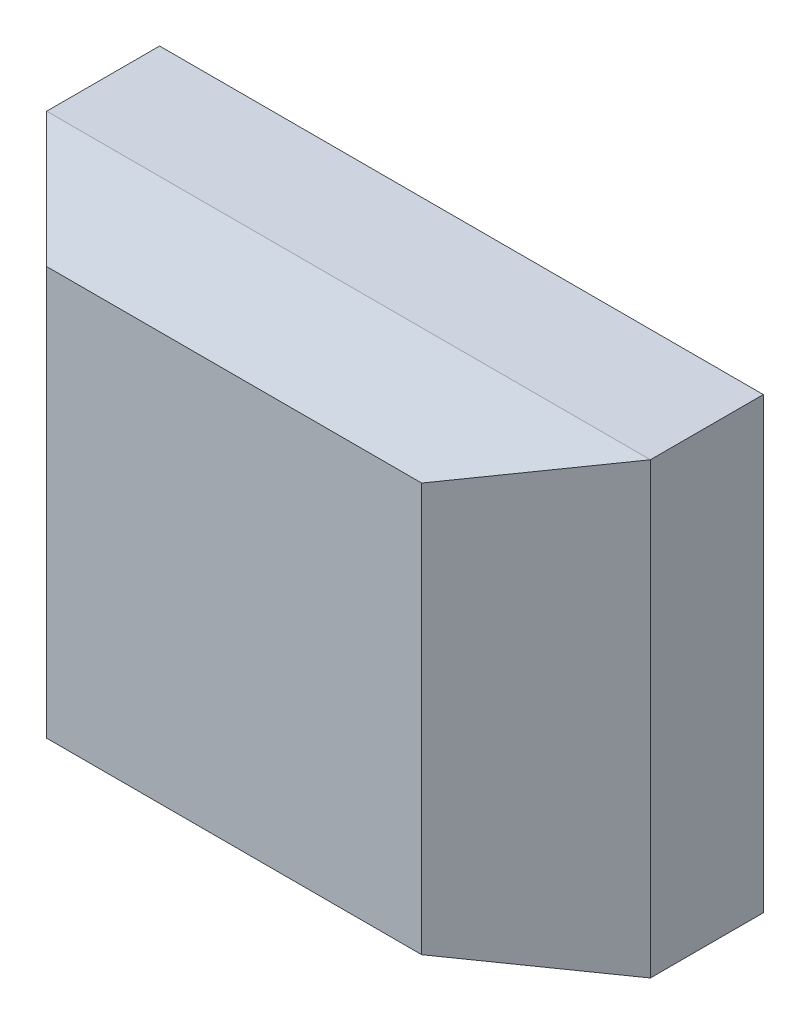
ISO-10303-21;
HEADER;
FILE_DESCRIPTION(('STEP AP214'),'2;1');
FILE_NAME('part.step','',(''),(''),'','','');
FILE_SCHEMA(('AUTOMOTIVE_DESIGN { 1 0 10303 214 1 1 1 1 }'));
ENDSEC;
DATA;
#1=APPLICATION_CONTEXT('core data for automotive mechanical design processes');
#2=APPLICATION_PROTOCOL_DEFINITION('international standard','automotive_design',2000,#1);
#3=PRODUCT_CONTEXT('',#1,'mechanical');
#4=PRODUCT('Part','Part','',(#3));
#5=PRODUCT_RELATED_PRODUCT_CATEGORY('part','',(#4));
#6=PRODUCT_DEFINITION_FORMATION('','',#4);
#7=PRODUCT_DEFINITION_CONTEXT('part definition',#1,'design');
#8=PRODUCT_DEFINITION('design','',#6,#7);
#9=PRODUCT_DEFINITION_SHAPE('','',#8);
#10=(LENGTH_UNIT() NAMED_UNIT(*) SI_UNIT(.MILLI.,.METRE.));
#11=(NAMED_UNIT(*) PLANE_ANGLE_UNIT() SI_UNIT($,.RADIAN.));
#12=(NAMED_UNIT(*) SI_UNIT($,.STERADIAN.) SOLID_ANGLE_UNIT());
#13=UNCERTAINTY_MEASURE_WITH_UNIT(LENGTH_MEASURE(1.E-05),#10,'distance_accuracy_value','');
#14=(GEOMETRIC_REPRESENTATION_CONTEXT(3) GLOBAL_UNCERTAINTY_ASSIGNED_CONTEXT((#13)) GLOBAL_UNIT_ASSIGNED_CONTEXT((#10,
#11,#12)) REPRESENTATION_CONTEXT('',''));
#15=CARTESIAN_POINT('',(0.,0.,0.));
#16=DIRECTION('',(0.,0.,1.));
#17=DIRECTION('',(1.,0.,0.));
#18=AXIS2_PLACEMENT_3D('',#15,#16,#17);
#19=CARTESIAN_POINT('',(2.085,-3.1,0.));
#20=DIRECTION('',(1.,0.,0.));
#21=DIRECTION('',(0.,0.,-1.));
#22=AXIS2_PLACEMENT_3D('',#19,#20,#21);
#23=PLANE('',#22);
#24=DIRECTION('',(0.,0.,-1.));
#25=VECTOR('',#24,1.);
#26=CARTESIAN_POINT('',(2.085,0.,0.));
#27=LINE('',#26,#25);
#28=CARTESIAN_POINT('',(2.085,0.,0.779999999999999));
#29=VERTEX_POINT('',#28);
#30=CARTESIAN_POINT('',(2.085,0.,0.));
#31=VERTEX_POINT('',#30);
#32=EDGE_CURVE('E141',#29,#31,#27,.T.);
#33=ORIENTED_EDGE('',*,*,#32,.F.);
#34=DIRECTION('',(0.,1.,0.));
#35=VECTOR('',#34,1.);
#36=CARTESIAN_POINT('',(2.085,-3.1,0.779999999999999));
#37=LINE('',#36,#35);
#38=CARTESIAN_POINT('',(2.085,-3.1,0.779999999999999));
#39=VERTEX_POINT('',#38);
#40=EDGE_CURVE('E11',#39,#29,#37,.T.);
#41=ORIENTED_EDGE('',*,*,#40,.F.);
#42=DIRECTION('',(0.,0.,-1.));
#43=VECTOR('',#42,1.);
#44=CARTESIAN_POINT('',(2.085,-3.1,0.));
#45=LINE('',#44,#43);
#46=CARTESIAN_POINT('',(2.085,-3.1,0.));
#47=VERTEX_POINT('',#46);
#48=EDGE_CURVE('E134',#39,#47,#45,.T.);
#49=ORIENTED_EDGE('',*,*,#48,.T.);
#50=DIRECTION('',(0.,1.,0.));
#51=VECTOR('',#50,1.);
#52=CARTESIAN_POINT('',(2.085,-3.1,0.));
#53=LINE('',#52,#51);
#54=EDGE_CURVE('E45',#47,#31,#53,.T.);
#55=ORIENTED_EDGE('',*,*,#54,.T.);
#56=EDGE_LOOP('',(#33,#41,#49,#55));
#57=FACE_BOUND('',#56,.T.);
#58=ADVANCED_FACE('F42',(#57),#23,.T.);
#59=CARTESIAN_POINT('',(2.085,-3.1,0.779999999999999));
#60=DIRECTION('',(0.707106781186546,0.,0.707106781186549));
#61=DIRECTION('',(0.707106781186549,0.,-0.707106781186546));
#62=AXIS2_PLACEMENT_3D('',#59,#60,#61);
#63=PLANE('',#62);
#64=DIRECTION('',(0.701673843159865,0.123724030206479,-0.701673843159863));
#65=VECTOR('',#64,1.);
#66=CARTESIAN_POINT('',(1.81587686112476,-0.0474536705166546,1.04912313887524));
#67=LINE('',#66,#65);
#68=CARTESIAN_POINT('',(1.295,-0.139298314759682,1.57));
#69=VERTEX_POINT('',#68);
#70=EDGE_CURVE('E83',#69,#29,#67,.T.);
#71=ORIENTED_EDGE('',*,*,#70,.F.);
#72=DIRECTION('',(0.,1.,0.));
#73=VECTOR('',#72,1.);
#74=CARTESIAN_POINT('',(1.295,-3.1,1.57));
#75=LINE('',#74,#73);
#76=CARTESIAN_POINT('',(1.295,-2.96070168524032,1.57));
#77=VERTEX_POINT('',#76);
#78=EDGE_CURVE('E52',#77,#69,#75,.T.);
#79=ORIENTED_EDGE('',*,*,#78,.F.);
#80=DIRECTION('',(-0.701673843159865,0.123724030206479,0.701673843159863));
#81=VECTOR('',#80,1.);
#82=CARTESIAN_POINT('',(2.085,-3.1,0.779999999999999));
#83=LINE('',#82,#81);
#84=EDGE_CURVE('E158',#39,#77,#83,.T.);
#85=ORIENTED_EDGE('',*,*,#84,.F.);
#86=ORIENTED_EDGE('',*,*,#40,.T.);
#87=EDGE_LOOP('',(#71,#79,#85,#86));
#88=FACE_BOUND('',#87,.T.);
#89=ADVANCED_FACE('F180',(#88),#63,.T.);
#90=CARTESIAN_POINT('',(1.295,-3.1,1.57));
#91=DIRECTION('',(0.,0.,1.));
#92=DIRECTION('',(1.,0.,0.));
#93=AXIS2_PLACEMENT_3D('',#90,#91,#92);
#94=PLANE('',#93);
#95=DIRECTION('',(1.,0.,0.));
#96=VECTOR('',#95,1.);
#97=CARTESIAN_POINT('',(1.295,-0.139298314759682,1.57));
#98=LINE('',#97,#96);
#99=CARTESIAN_POINT('',(-1.295,-0.139298314759682,1.57));
#100=VERTEX_POINT('',#99);
#101=EDGE_CURVE('E121',#100,#69,#98,.T.);
#102=ORIENTED_EDGE('',*,*,#101,.F.);
#103=DIRECTION('',(0.,1.,0.));
#104=VECTOR('',#103,1.);
#105=CARTESIAN_POINT('',(-1.295,-3.1,1.57));
#106=LINE('',#105,#104);
#107=CARTESIAN_POINT('',(-1.295,-2.96070168524032,1.57));
#108=VERTEX_POINT('',#107);
#109=EDGE_CURVE('E119',#108,#100,#106,.T.);
#110=ORIENTED_EDGE('',*,*,#109,.F.);
#111=DIRECTION('',(-1.,0.,0.));
#112=VECTOR('',#111,1.);
#113=CARTESIAN_POINT('',(1.295,-2.96070168524032,1.57));
#114=LINE('',#113,#112);
#115=EDGE_CURVE('E160',#77,#108,#114,.T.);
#116=ORIENTED_EDGE('',*,*,#115,.F.);
#117=ORIENTED_EDGE('',*,*,#78,.T.);
#118=EDGE_LOOP('',(#102,#110,#116,#117));
#119=FACE_BOUND('',#118,.T.);
#120=ADVANCED_FACE('F194',(#119),#94,.T.);
#121=CARTESIAN_POINT('',(-2.085,-3.1,0.779999999999999));
#122=DIRECTION('',(-0.707106781186546,0.,0.707106781186549));
#123=DIRECTION('',(0.707106781186549,0.,0.707106781186546));
#124=AXIS2_PLACEMENT_3D('',#121,#122,#123);
#125=PLANE('',#124);
#126=DIRECTION('',(0.701673843159865,-0.123724030206479,0.701673843159863));
#127=VECTOR('',#126,1.);
#128=CARTESIAN_POINT('',(-1.81587686112476,-0.0474536705166546,1.04912313887524));
#129=LINE('',#128,#127);
#130=CARTESIAN_POINT('',(-2.085,0.,0.779999999999999));
#131=VERTEX_POINT('',#130);
#132=EDGE_CURVE('E103',#131,#100,#129,.T.);
#133=ORIENTED_EDGE('',*,*,#132,.F.);
#134=DIRECTION('',(0.,1.,0.));
#135=VECTOR('',#134,1.);
#136=CARTESIAN_POINT('',(-2.085,-3.1,0.779999999999999));
#137=LINE('',#136,#135);
#138=CARTESIAN_POINT('',(-2.085,-3.1,0.779999999999999));
#139=VERTEX_POINT('',#138);
#140=EDGE_CURVE('E116',#139,#131,#137,.T.);
#141=ORIENTED_EDGE('',*,*,#140,.F.);
#142=DIRECTION('',(-0.701673843159865,-0.123724030206479,-0.701673843159863));
#143=VECTOR('',#142,1.);
#144=CARTESIAN_POINT('',(-2.085,-3.1,0.779999999999999));
#145=LINE('',#144,#143);
#146=EDGE_CURVE('E61',#108,#139,#145,.T.);
#147=ORIENTED_EDGE('',*,*,#146,.F.);
#148=ORIENTED_EDGE('',*,*,#109,.T.);
#149=EDGE_LOOP('',(#133,#141,#147,#148));
#150=FACE_BOUND('',#149,.T.);
#151=ADVANCED_FACE('F115',(#150),#125,.T.);
#152=CARTESIAN_POINT('',(-2.085,-3.1,0.));
#153=DIRECTION('',(-1.,0.,0.));
#154=DIRECTION('',(0.,0.,1.));
#155=AXIS2_PLACEMENT_3D('',#152,#153,#154);
#156=PLANE('',#155);
#157=DIRECTION('',(0.,0.,1.));
#158=VECTOR('',#157,1.);
#159=CARTESIAN_POINT('',(-2.085,0.,0.));
#160=LINE('',#159,#158);
#161=CARTESIAN_POINT('',(-2.085,0.,0.));
#162=VERTEX_POINT('',#161);
#163=EDGE_CURVE('E125',#162,#131,#160,.T.);
#164=ORIENTED_EDGE('',*,*,#163,.F.);
#165=DIRECTION('',(0.,1.,0.));
#166=VECTOR('',#165,1.);
#167=CARTESIAN_POINT('',(-2.085,-3.1,0.));
#168=LINE('',#167,#166);
#169=CARTESIAN_POINT('',(-2.085,-3.1,0.));
#170=VERTEX_POINT('',#169);
#171=EDGE_CURVE('E76',#170,#162,#168,.T.);
#172=ORIENTED_EDGE('',*,*,#171,.F.);
#173=DIRECTION('',(0.,0.,1.));
#174=VECTOR('',#173,1.);
#175=CARTESIAN_POINT('',(-2.085,-3.1,0.));
#176=LINE('',#175,#174);
#177=EDGE_CURVE('E128',#170,#139,#176,.T.);
#178=ORIENTED_EDGE('',*,*,#177,.T.);
#179=ORIENTED_EDGE('',*,*,#140,.T.);
#180=EDGE_LOOP('',(#164,#172,#178,#179));
#181=FACE_BOUND('',#180,.T.);
#182=ADVANCED_FACE('F124',(#181),#156,.T.);
#183=CARTESIAN_POINT('',(-2.085,-3.1,0.));
#184=DIRECTION('',(0.,0.,-1.));
#185=DIRECTION('',(-1.,0.,0.));
#186=AXIS2_PLACEMENT_3D('',#183,#184,#185);
#187=PLANE('',#186);
#188=DIRECTION('',(-1.,0.,0.));
#189=VECTOR('',#188,1.);
#190=CARTESIAN_POINT('',(-2.085,0.,0.));
#191=LINE('',#190,#189);
#192=EDGE_CURVE('E132',#31,#162,#191,.T.);
#193=ORIENTED_EDGE('',*,*,#192,.F.);
#194=ORIENTED_EDGE('',*,*,#54,.F.);
#195=DIRECTION('',(-1.,0.,0.));
#196=VECTOR('',#195,1.);
#197=CARTESIAN_POINT('',(-2.085,-3.1,0.));
#198=LINE('',#197,#196);
#199=EDGE_CURVE('E139',#47,#170,#198,.T.);
#200=ORIENTED_EDGE('',*,*,#199,.T.);
#201=ORIENTED_EDGE('',*,*,#171,.T.);
#202=EDGE_LOOP('',(#193,#194,#200,#201));
#203=FACE_BOUND('',#202,.T.);
#204=ADVANCED_FACE('F182',(#203),#187,.T.);
#205=CARTESIAN_POINT('',(0.,-3.1,0.));
#206=DIRECTION('',(0.,-1.,0.));
#207=DIRECTION('',(0.,0.,-1.));
#208=AXIS2_PLACEMENT_3D('',#205,#206,#207);
#209=PLANE('',#208);
#210=DIRECTION('',(1.,0.,0.));
#211=VECTOR('',#210,1.);
#212=CARTESIAN_POINT('',(-2.085,-3.1,0.779999999999999));
#213=LINE('',#212,#211);
#214=EDGE_CURVE('E109',#139,#39,#213,.T.);
#215=ORIENTED_EDGE('',*,*,#214,.F.);
#216=ORIENTED_EDGE('',*,*,#177,.F.);
#217=ORIENTED_EDGE('',*,*,#199,.F.);
#218=ORIENTED_EDGE('',*,*,#48,.F.);
#219=EDGE_LOOP('',(#215,#216,#217,#218));
#220=FACE_BOUND('',#219,.T.);
#221=ADVANCED_FACE('F181',(#220),#209,.T.);
#222=CARTESIAN_POINT('',(0.,0.,0.));
#223=DIRECTION('',(0.,-1.,0.));
#224=DIRECTION('',(0.,0.,-1.));
#225=AXIS2_PLACEMENT_3D('',#222,#223,#224);
#226=PLANE('',#225);
#227=ORIENTED_EDGE('',*,*,#163,.T.);
#228=DIRECTION('',(1.,0.,0.));
#229=VECTOR('',#228,1.);
#230=CARTESIAN_POINT('',(-2.085,0.,0.779999999999999));
#231=LINE('',#230,#229);
#232=EDGE_CURVE('E100',#131,#29,#231,.T.);
#233=ORIENTED_EDGE('',*,*,#232,.T.);
#234=ORIENTED_EDGE('',*,*,#32,.T.);
#235=ORIENTED_EDGE('',*,*,#192,.T.);
#236=EDGE_LOOP('',(#227,#233,#234,#235));
#237=FACE_BOUND('',#236,.T.);
#238=ADVANCED_FACE('F131',(#237),#226,.F.);
#239=CARTESIAN_POINT('',(-2.085,0.,0.779999999999999));
#240=DIRECTION('',(0.,-0.984807753012209,-0.173648177666924));
#241=DIRECTION('',(0.,0.173648177666924,-0.984807753012209));
#242=AXIS2_PLACEMENT_3D('',#239,#240,#241);
#243=PLANE('',#242);
#244=ORIENTED_EDGE('',*,*,#70,.T.);
#245=ORIENTED_EDGE('',*,*,#232,.F.);
#246=ORIENTED_EDGE('',*,*,#132,.T.);
#247=ORIENTED_EDGE('',*,*,#101,.T.);
#248=EDGE_LOOP('',(#244,#245,#246,#247));
#249=FACE_BOUND('',#248,.T.);
#250=ADVANCED_FACE('F102',(#249),#243,.F.);
#251=CARTESIAN_POINT('',(-2.085,-3.1,0.779999999999999));
#252=DIRECTION('',(0.,0.984807753012209,-0.173648177666924));
#253=DIRECTION('',(0.,0.173648177666924,0.984807753012209));
#254=AXIS2_PLACEMENT_3D('',#251,#252,#253);
#255=PLANE('',#254);
#256=ORIENTED_EDGE('',*,*,#84,.T.);
#257=ORIENTED_EDGE('',*,*,#115,.T.);
#258=ORIENTED_EDGE('',*,*,#146,.T.);
#259=ORIENTED_EDGE('',*,*,#214,.T.);
#260=EDGE_LOOP('',(#256,#257,#258,#259));
#261=FACE_BOUND('',#260,.T.);
#262=ADVANCED_FACE('F174',(#261),#255,.F.);
#263=CLOSED_SHELL('',(#58,#89,#120,#151,#182,#204,#221,#238,#250,#262));
#264=MANIFOLD_SOLID_BREP('B2',#263);
#265=ADVANCED_BREP_SHAPE_REPRESENTATION('',(#18,#264),#14);
#266=SHAPE_DEFINITION_REPRESENTATION(#9,#265);
ENDSEC;
END-ISO-10303-21;
